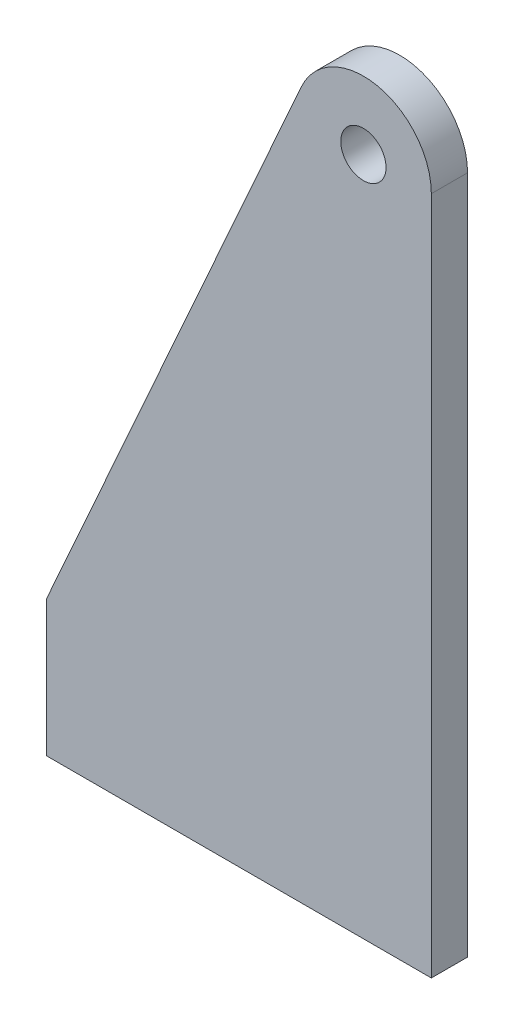
ISO-10303-21;
HEADER;
FILE_DESCRIPTION(('STEP AP214'),'2;1');
FILE_NAME('part.step','',(''),(''),'','','');
FILE_SCHEMA(('AUTOMOTIVE_DESIGN { 1 0 10303 214 1 1 1 1 }'));
ENDSEC;
DATA;
#1=APPLICATION_CONTEXT('core data for automotive mechanical design processes');
#2=APPLICATION_PROTOCOL_DEFINITION('international standard','automotive_design',2000,#1);
#3=PRODUCT_CONTEXT('',#1,'mechanical');
#4=PRODUCT('Part','Part','',(#3));
#5=PRODUCT_RELATED_PRODUCT_CATEGORY('part','',(#4));
#6=PRODUCT_DEFINITION_FORMATION('','',#4);
#7=PRODUCT_DEFINITION_CONTEXT('part definition',#1,'design');
#8=PRODUCT_DEFINITION('design','',#6,#7);
#9=PRODUCT_DEFINITION_SHAPE('','',#8);
#10=(LENGTH_UNIT() NAMED_UNIT(*) SI_UNIT(.MILLI.,.METRE.));
#11=(NAMED_UNIT(*) PLANE_ANGLE_UNIT() SI_UNIT($,.RADIAN.));
#12=(NAMED_UNIT(*) SI_UNIT($,.STERADIAN.) SOLID_ANGLE_UNIT());
#13=UNCERTAINTY_MEASURE_WITH_UNIT(LENGTH_MEASURE(1.E-05),#10,'distance_accuracy_value','');
#14=(GEOMETRIC_REPRESENTATION_CONTEXT(3) GLOBAL_UNCERTAINTY_ASSIGNED_CONTEXT((#13)) GLOBAL_UNIT_ASSIGNED_CONTEXT((#10,
#11,#12)) REPRESENTATION_CONTEXT('',''));
#15=CARTESIAN_POINT('',(0.,0.,0.));
#16=DIRECTION('',(0.,0.,1.));
#17=DIRECTION('',(1.,0.,0.));
#18=AXIS2_PLACEMENT_3D('',#15,#16,#17);
#19=CARTESIAN_POINT('',(-15.,150.,8.));
#20=DIRECTION('',(0.,0.,1.));
#21=DIRECTION('',(1.,0.,0.));
#22=AXIS2_PLACEMENT_3D('',#19,#20,#21);
#23=PLANE('',#22);
#24=DIRECTION('',(1.,0.,0.));
#25=VECTOR('',#24,1.);
#26=CARTESIAN_POINT('',(-85.,0.,8.));
#27=LINE('',#26,#25);
#28=CARTESIAN_POINT('',(-85.,0.,8.));
#29=VERTEX_POINT('',#28);
#30=CARTESIAN_POINT('',(0.,0.,8.));
#31=VERTEX_POINT('',#30);
#32=EDGE_CURVE('E121',#29,#31,#27,.T.);
#33=ORIENTED_EDGE('',*,*,#32,.T.);
#34=DIRECTION('',(0.,1.,0.));
#35=VECTOR('',#34,1.);
#36=CARTESIAN_POINT('',(0.,0.,8.));
#37=LINE('',#36,#35);
#38=CARTESIAN_POINT('',(0.,150.,8.));
#39=VERTEX_POINT('',#38);
#40=EDGE_CURVE('E88',#31,#39,#37,.T.);
#41=ORIENTED_EDGE('',*,*,#40,.T.);
#42=CARTESIAN_POINT('',(-15.,150.,8.));
#43=DIRECTION('',(0.,0.,1.));
#44=DIRECTION('',(1.,0.,0.));
#45=AXIS2_PLACEMENT_3D('',#42,#43,#44);
#46=CIRCLE('',#45,15.);
#47=CARTESIAN_POINT('',(-28.6969995701967,156.114916415948,8.));
#48=VERTEX_POINT('',#47);
#49=EDGE_CURVE('E92',#39,#48,#46,.T.);
#50=ORIENTED_EDGE('',*,*,#49,.T.);
#51=DIRECTION('',(-0.407661094396539,-0.91313330467978,0.));
#52=VECTOR('',#51,1.);
#53=CARTESIAN_POINT('',(-28.6969995701967,156.114916415948,8.));
#54=LINE('',#53,#52);
#55=CARTESIAN_POINT('',(-85.,30.,8.));
#56=VERTEX_POINT('',#55);
#57=EDGE_CURVE('E96',#48,#56,#54,.T.);
#58=ORIENTED_EDGE('',*,*,#57,.T.);
#59=DIRECTION('',(0.,-1.,0.));
#60=VECTOR('',#59,1.);
#61=CARTESIAN_POINT('',(-85.,30.,8.));
#62=LINE('',#61,#60);
#63=EDGE_CURVE('E54',#56,#29,#62,.T.);
#64=ORIENTED_EDGE('',*,*,#63,.T.);
#65=EDGE_LOOP('',(#33,#41,#50,#58,#64));
#66=FACE_BOUND('',#65,.T.);
#67=CARTESIAN_POINT('',(-15.,150.,8.));
#68=DIRECTION('',(0.,0.,1.));
#69=DIRECTION('',(1.,0.,0.));
#70=AXIS2_PLACEMENT_3D('',#67,#68,#69);
#71=CIRCLE('',#70,5.);
#72=CARTESIAN_POINT('',(-10.,150.,8.));
#73=VERTEX_POINT('',#72);
#74=EDGE_CURVE('E116',#73,#73,#71,.T.);
#75=ORIENTED_EDGE('',*,*,#74,.F.);
#76=EDGE_LOOP('',(#75));
#77=FACE_BOUND('',#76,.T.);
#78=ADVANCED_FACE('F37',(#66,#77),#23,.T.);
#79=CARTESIAN_POINT('',(-15.,150.,0.));
#80=DIRECTION('',(0.,0.,1.));
#81=DIRECTION('',(1.,0.,0.));
#82=AXIS2_PLACEMENT_3D('',#79,#80,#81);
#83=PLANE('',#82);
#84=DIRECTION('',(1.,0.,0.));
#85=VECTOR('',#84,1.);
#86=CARTESIAN_POINT('',(-85.,0.,0.));
#87=LINE('',#86,#85);
#88=CARTESIAN_POINT('',(-85.,0.,0.));
#89=VERTEX_POINT('',#88);
#90=CARTESIAN_POINT('',(0.,0.,0.));
#91=VERTEX_POINT('',#90);
#92=EDGE_CURVE('E112',#89,#91,#87,.T.);
#93=ORIENTED_EDGE('',*,*,#92,.F.);
#94=DIRECTION('',(0.,-1.,0.));
#95=VECTOR('',#94,1.);
#96=CARTESIAN_POINT('',(-85.,30.,0.));
#97=LINE('',#96,#95);
#98=CARTESIAN_POINT('',(-85.,30.,0.));
#99=VERTEX_POINT('',#98);
#100=EDGE_CURVE('E80',#99,#89,#97,.T.);
#101=ORIENTED_EDGE('',*,*,#100,.F.);
#102=DIRECTION('',(-0.407661094396539,-0.91313330467978,0.));
#103=VECTOR('',#102,1.);
#104=CARTESIAN_POINT('',(-28.6969995701967,156.114916415948,0.));
#105=LINE('',#104,#103);
#106=CARTESIAN_POINT('',(-28.6969995701967,156.114916415948,0.));
#107=VERTEX_POINT('',#106);
#108=EDGE_CURVE('E74',#107,#99,#105,.T.);
#109=ORIENTED_EDGE('',*,*,#108,.F.);
#110=CARTESIAN_POINT('',(-15.,150.,0.));
#111=DIRECTION('',(0.,0.,1.));
#112=DIRECTION('',(1.,0.,0.));
#113=AXIS2_PLACEMENT_3D('',#110,#111,#112);
#114=CIRCLE('',#113,15.);
#115=CARTESIAN_POINT('',(0.,150.,0.));
#116=VERTEX_POINT('',#115);
#117=EDGE_CURVE('E103',#116,#107,#114,.T.);
#118=ORIENTED_EDGE('',*,*,#117,.F.);
#119=DIRECTION('',(0.,1.,0.));
#120=VECTOR('',#119,1.);
#121=CARTESIAN_POINT('',(0.,0.,0.));
#122=LINE('',#121,#120);
#123=EDGE_CURVE('E115',#91,#116,#122,.T.);
#124=ORIENTED_EDGE('',*,*,#123,.F.);
#125=EDGE_LOOP('',(#93,#101,#109,#118,#124));
#126=FACE_BOUND('',#125,.T.);
#127=CARTESIAN_POINT('',(-15.,150.,0.));
#128=DIRECTION('',(0.,0.,1.));
#129=DIRECTION('',(1.,0.,0.));
#130=AXIS2_PLACEMENT_3D('',#127,#128,#129);
#131=CIRCLE('',#130,5.);
#132=CARTESIAN_POINT('',(-10.,150.,0.));
#133=VERTEX_POINT('',#132);
#134=EDGE_CURVE('E217',#133,#133,#131,.T.);
#135=ORIENTED_EDGE('',*,*,#134,.T.);
#136=EDGE_LOOP('',(#135));
#137=FACE_BOUND('',#136,.T.);
#138=ADVANCED_FACE('F125',(#126,#137),#83,.F.);
#139=CARTESIAN_POINT('',(-85.,0.,8.));
#140=DIRECTION('',(0.,1.,0.));
#141=DIRECTION('',(0.,0.,1.));
#142=AXIS2_PLACEMENT_3D('',#139,#140,#141);
#143=PLANE('',#142);
#144=ORIENTED_EDGE('',*,*,#92,.T.);
#145=DIRECTION('',(0.,0.,-1.));
#146=VECTOR('',#145,1.);
#147=CARTESIAN_POINT('',(0.,0.,8.));
#148=LINE('',#147,#146);
#149=EDGE_CURVE('E11',#31,#91,#148,.T.);
#150=ORIENTED_EDGE('',*,*,#149,.F.);
#151=ORIENTED_EDGE('',*,*,#32,.F.);
#152=DIRECTION('',(0.,0.,-1.));
#153=VECTOR('',#152,1.);
#154=CARTESIAN_POINT('',(-85.,0.,8.));
#155=LINE('',#154,#153);
#156=EDGE_CURVE('E108',#29,#89,#155,.T.);
#157=ORIENTED_EDGE('',*,*,#156,.T.);
#158=EDGE_LOOP('',(#144,#150,#151,#157));
#159=FACE_BOUND('',#158,.T.);
#160=ADVANCED_FACE('F39',(#159),#143,.F.);
#161=CARTESIAN_POINT('',(0.,0.,8.));
#162=DIRECTION('',(-1.,0.,0.));
#163=DIRECTION('',(0.,0.,1.));
#164=AXIS2_PLACEMENT_3D('',#161,#162,#163);
#165=PLANE('',#164);
#166=ORIENTED_EDGE('',*,*,#123,.T.);
#167=DIRECTION('',(0.,0.,-1.));
#168=VECTOR('',#167,1.);
#169=CARTESIAN_POINT('',(0.,150.,8.));
#170=LINE('',#169,#168);
#171=EDGE_CURVE('E46',#39,#116,#170,.T.);
#172=ORIENTED_EDGE('',*,*,#171,.F.);
#173=ORIENTED_EDGE('',*,*,#40,.F.);
#174=ORIENTED_EDGE('',*,*,#149,.T.);
#175=EDGE_LOOP('',(#166,#172,#173,#174));
#176=FACE_BOUND('',#175,.T.);
#177=ADVANCED_FACE('F150',(#176),#165,.F.);
#178=CARTESIAN_POINT('',(-15.,150.,8.));
#179=DIRECTION('',(0.,0.,-1.));
#180=DIRECTION('',(-1.,0.,0.));
#181=AXIS2_PLACEMENT_3D('',#178,#179,#180);
#182=CYLINDRICAL_SURFACE('',#181,15.);
#183=ORIENTED_EDGE('',*,*,#117,.T.);
#184=DIRECTION('',(0.,0.,-1.));
#185=VECTOR('',#184,1.);
#186=CARTESIAN_POINT('',(-28.6969995701967,156.114916415948,8.));
#187=LINE('',#186,#185);
#188=EDGE_CURVE('E100',#48,#107,#187,.T.);
#189=ORIENTED_EDGE('',*,*,#188,.F.);
#190=ORIENTED_EDGE('',*,*,#49,.F.);
#191=ORIENTED_EDGE('',*,*,#171,.T.);
#192=EDGE_LOOP('',(#183,#189,#190,#191));
#193=FACE_BOUND('',#192,.T.);
#194=ADVANCED_FACE('F101',(#193),#182,.T.);
#195=CARTESIAN_POINT('',(-28.6969995701967,156.114916415948,8.));
#196=DIRECTION('',(0.91313330467978,-0.407661094396539,0.));
#197=DIRECTION('',(0.407661094396539,0.91313330467978,0.));
#198=AXIS2_PLACEMENT_3D('',#195,#196,#197);
#199=PLANE('',#198);
#200=ORIENTED_EDGE('',*,*,#108,.T.);
#201=DIRECTION('',(0.,0.,-1.));
#202=VECTOR('',#201,1.);
#203=CARTESIAN_POINT('',(-85.,30.,8.));
#204=LINE('',#203,#202);
#205=EDGE_CURVE('E104',#56,#99,#204,.T.);
#206=ORIENTED_EDGE('',*,*,#205,.F.);
#207=ORIENTED_EDGE('',*,*,#57,.F.);
#208=ORIENTED_EDGE('',*,*,#188,.T.);
#209=EDGE_LOOP('',(#200,#206,#207,#208));
#210=FACE_BOUND('',#209,.T.);
#211=ADVANCED_FACE('F106',(#210),#199,.F.);
#212=CARTESIAN_POINT('',(-85.,30.,8.));
#213=DIRECTION('',(1.,0.,0.));
#214=DIRECTION('',(0.,0.,-1.));
#215=AXIS2_PLACEMENT_3D('',#212,#213,#214);
#216=PLANE('',#215);
#217=ORIENTED_EDGE('',*,*,#100,.T.);
#218=ORIENTED_EDGE('',*,*,#156,.F.);
#219=ORIENTED_EDGE('',*,*,#63,.F.);
#220=ORIENTED_EDGE('',*,*,#205,.T.);
#221=EDGE_LOOP('',(#217,#218,#219,#220));
#222=FACE_BOUND('',#221,.T.);
#223=ADVANCED_FACE('F130',(#222),#216,.F.);
#224=CARTESIAN_POINT('',(-15.,150.,8.));
#225=DIRECTION('',(0.,0.,-1.));
#226=DIRECTION('',(-1.,0.,0.));
#227=AXIS2_PLACEMENT_3D('',#224,#225,#226);
#228=CYLINDRICAL_SURFACE('',#227,5.);
#229=ORIENTED_EDGE('',*,*,#74,.T.);
#230=EDGE_LOOP('',(#229));
#231=FACE_BOUND('',#230,.T.);
#232=ORIENTED_EDGE('',*,*,#134,.F.);
#233=EDGE_LOOP('',(#232));
#234=FACE_BOUND('',#233,.T.);
#235=ADVANCED_FACE('F132',(#231,#234),#228,.F.);
#236=CLOSED_SHELL('',(#78,#138,#160,#177,#194,#211,#223,#235));
#237=MANIFOLD_SOLID_BREP('B2',#236);
#238=ADVANCED_BREP_SHAPE_REPRESENTATION('',(#18,#237),#14);
#239=SHAPE_DEFINITION_REPRESENTATION(#9,#238);
ENDSEC;
END-ISO-10303-21;
